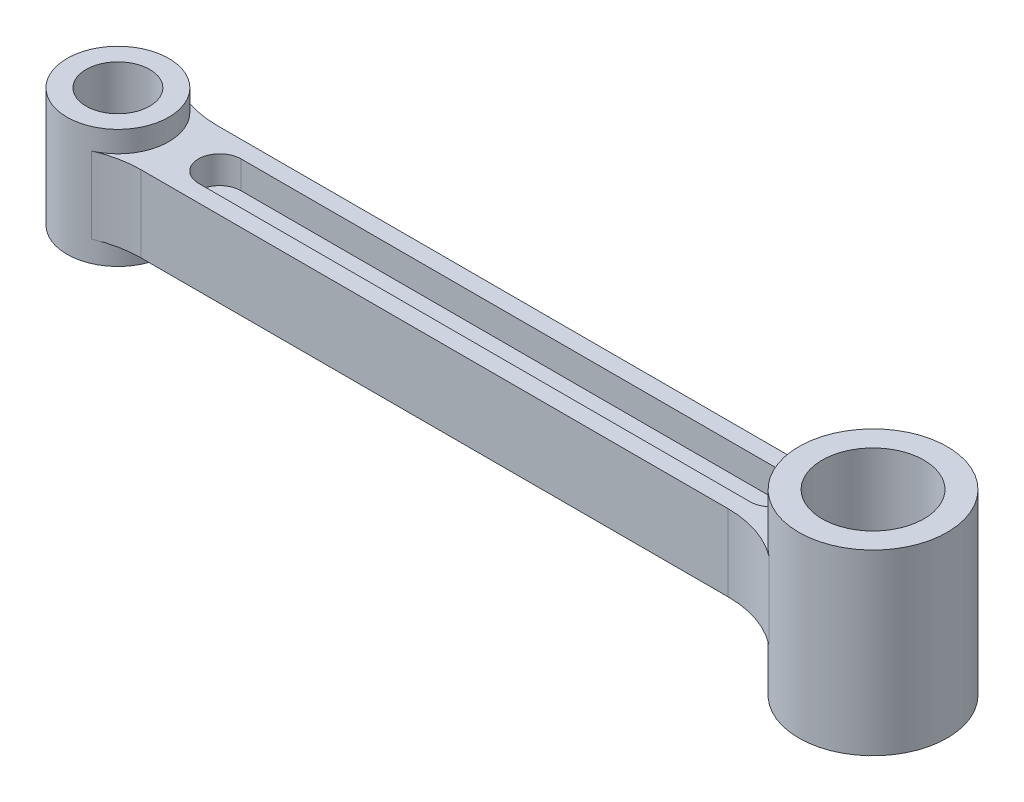
ISO-10303-21;
HEADER;
FILE_DESCRIPTION(('STEP AP214'),'2;1');
FILE_NAME('part.step','',(''),(''),'','','');
FILE_SCHEMA(('AUTOMOTIVE_DESIGN { 1 0 10303 214 1 1 1 1 }'));
ENDSEC;
DATA;
#1=APPLICATION_CONTEXT('core data for automotive mechanical design processes');
#2=APPLICATION_PROTOCOL_DEFINITION('international standard','automotive_design',2000,#1);
#3=PRODUCT_CONTEXT('',#1,'mechanical');
#4=PRODUCT('Part','Part','',(#3));
#5=PRODUCT_RELATED_PRODUCT_CATEGORY('part','',(#4));
#6=PRODUCT_DEFINITION_FORMATION('','',#4);
#7=PRODUCT_DEFINITION_CONTEXT('part definition',#1,'design');
#8=PRODUCT_DEFINITION('design','',#6,#7);
#9=PRODUCT_DEFINITION_SHAPE('','',#8);
#10=(LENGTH_UNIT() NAMED_UNIT(*) SI_UNIT(.MILLI.,.METRE.));
#11=(NAMED_UNIT(*) PLANE_ANGLE_UNIT() SI_UNIT($,.RADIAN.));
#12=(NAMED_UNIT(*) SI_UNIT($,.STERADIAN.) SOLID_ANGLE_UNIT());
#13=UNCERTAINTY_MEASURE_WITH_UNIT(LENGTH_MEASURE(1.E-05),#10,'distance_accuracy_value','');
#14=(GEOMETRIC_REPRESENTATION_CONTEXT(3) GLOBAL_UNCERTAINTY_ASSIGNED_CONTEXT((#13)) GLOBAL_UNIT_ASSIGNED_CONTEXT((#10,
#11,#12)) REPRESENTATION_CONTEXT('',''));
#15=CARTESIAN_POINT('',(0.,0.,0.));
#16=DIRECTION('',(0.,0.,1.));
#17=DIRECTION('',(1.,0.,0.));
#18=AXIS2_PLACEMENT_3D('',#15,#16,#17);
#19=CARTESIAN_POINT('',(154.,9.,0.));
#20=DIRECTION('',(0.,-1.,0.));
#21=DIRECTION('',(0.,0.,-1.));
#22=AXIS2_PLACEMENT_3D('',#19,#20,#21);
#23=CYLINDRICAL_SURFACE('',#22,5.);
#24=DIRECTION('',(0.,-1.,0.));
#25=VECTOR('',#24,1.);
#26=CARTESIAN_POINT('',(154.,9.,4.99999999999998));
#27=LINE('',#26,#25);
#28=CARTESIAN_POINT('',(154.,-2.5,4.99999999999998));
#29=VERTEX_POINT('',#28);
#30=CARTESIAN_POINT('',(154.,-9.,4.99999999999998));
#31=VERTEX_POINT('',#30);
#32=EDGE_CURVE('E180',#29,#31,#27,.T.);
#33=ORIENTED_EDGE('',*,*,#32,.F.);
#34=CARTESIAN_POINT('',(154.,-2.5,0.));
#35=DIRECTION('',(0.,1.,0.));
#36=DIRECTION('',(0.,0.,1.));
#37=AXIS2_PLACEMENT_3D('',#34,#35,#36);
#38=CIRCLE('',#37,5.);
#39=CARTESIAN_POINT('',(154.,-2.5,-5.00000000000002));
#40=VERTEX_POINT('',#39);
#41=EDGE_CURVE('E329',#29,#40,#38,.T.);
#42=ORIENTED_EDGE('',*,*,#41,.T.);
#43=DIRECTION('',(0.,-1.,0.));
#44=VECTOR('',#43,1.);
#45=CARTESIAN_POINT('',(154.,9.,-5.00000000000002));
#46=LINE('',#45,#44);
#47=CARTESIAN_POINT('',(154.,-9.,-5.00000000000002));
#48=VERTEX_POINT('',#47);
#49=EDGE_CURVE('E209',#40,#48,#46,.T.);
#50=ORIENTED_EDGE('',*,*,#49,.T.);
#51=CARTESIAN_POINT('',(154.,-9.,0.));
#52=DIRECTION('',(0.,1.,0.));
#53=DIRECTION('',(0.,0.,1.));
#54=AXIS2_PLACEMENT_3D('',#51,#52,#53);
#55=CIRCLE('',#54,5.);
#56=EDGE_CURVE('E300',#31,#48,#55,.T.);
#57=ORIENTED_EDGE('',*,*,#56,.F.);
#58=EDGE_LOOP('',(#33,#42,#50,#57));
#59=FACE_BOUND('',#58,.T.);
#60=ADVANCED_FACE('F39',(#59),#23,.F.);
#61=CARTESIAN_POINT('',(0.,9.,5.));
#62=DIRECTION('',(0.,0.,-1.));
#63=DIRECTION('',(-1.,0.,0.));
#64=AXIS2_PLACEMENT_3D('',#61,#62,#63);
#65=PLANE('',#64);
#66=DIRECTION('',(0.,-1.,0.));
#67=VECTOR('',#66,1.);
#68=CARTESIAN_POINT('',(24.,9.,5.));
#69=LINE('',#68,#67);
#70=CARTESIAN_POINT('',(24.,-2.5,5.));
#71=VERTEX_POINT('',#70);
#72=CARTESIAN_POINT('',(24.,-9.,5.));
#73=VERTEX_POINT('',#72);
#74=EDGE_CURVE('E316',#71,#73,#69,.T.);
#75=ORIENTED_EDGE('',*,*,#74,.F.);
#76=DIRECTION('',(1.,0.,0.));
#77=VECTOR('',#76,1.);
#78=CARTESIAN_POINT('',(0.,-2.5,5.));
#79=LINE('',#78,#77);
#80=EDGE_CURVE('E56',#71,#29,#79,.T.);
#81=ORIENTED_EDGE('',*,*,#80,.T.);
#82=ORIENTED_EDGE('',*,*,#32,.T.);
#83=DIRECTION('',(1.,0.,0.));
#84=VECTOR('',#83,1.);
#85=CARTESIAN_POINT('',(0.,-9.,5.));
#86=LINE('',#85,#84);
#87=EDGE_CURVE('E303',#73,#31,#86,.T.);
#88=ORIENTED_EDGE('',*,*,#87,.F.);
#89=EDGE_LOOP('',(#75,#81,#82,#88));
#90=FACE_BOUND('',#89,.T.);
#91=ADVANCED_FACE('F231',(#90),#65,.T.);
#92=CARTESIAN_POINT('',(24.,9.,0.));
#93=DIRECTION('',(0.,-1.,0.));
#94=DIRECTION('',(0.,0.,-1.));
#95=AXIS2_PLACEMENT_3D('',#92,#93,#94);
#96=CYLINDRICAL_SURFACE('',#95,5.);
#97=DIRECTION('',(0.,-1.,0.));
#98=VECTOR('',#97,1.);
#99=CARTESIAN_POINT('',(24.,9.,-5.));
#100=LINE('',#99,#98);
#101=CARTESIAN_POINT('',(24.,-2.5,-5.));
#102=VERTEX_POINT('',#101);
#103=CARTESIAN_POINT('',(24.,-9.,-5.));
#104=VERTEX_POINT('',#103);
#105=EDGE_CURVE('E313',#102,#104,#100,.T.);
#106=ORIENTED_EDGE('',*,*,#105,.F.);
#107=CARTESIAN_POINT('',(24.,-2.5,0.));
#108=DIRECTION('',(0.,1.,0.));
#109=DIRECTION('',(0.,0.,1.));
#110=AXIS2_PLACEMENT_3D('',#107,#108,#109);
#111=CIRCLE('',#110,5.);
#112=EDGE_CURVE('E64',#102,#71,#111,.T.);
#113=ORIENTED_EDGE('',*,*,#112,.T.);
#114=ORIENTED_EDGE('',*,*,#74,.T.);
#115=CARTESIAN_POINT('',(24.,-9.,0.));
#116=DIRECTION('',(0.,1.,0.));
#117=DIRECTION('',(0.,0.,1.));
#118=AXIS2_PLACEMENT_3D('',#115,#116,#117);
#119=CIRCLE('',#118,5.);
#120=EDGE_CURVE('E306',#104,#73,#119,.T.);
#121=ORIENTED_EDGE('',*,*,#120,.F.);
#122=EDGE_LOOP('',(#106,#113,#114,#121));
#123=FACE_BOUND('',#122,.T.);
#124=ADVANCED_FACE('F236',(#123),#96,.F.);
#125=CARTESIAN_POINT('',(0.,9.,-4.99999999999999));
#126=DIRECTION('',(0.,0.,-1.));
#127=DIRECTION('',(-1.,0.,0.));
#128=AXIS2_PLACEMENT_3D('',#125,#126,#127);
#129=PLANE('',#128);
#130=DIRECTION('',(1.,0.,0.));
#131=VECTOR('',#130,1.);
#132=CARTESIAN_POINT('',(0.,-2.5,-4.99999999999999));
#133=LINE('',#132,#131);
#134=EDGE_CURVE('E323',#102,#40,#133,.T.);
#135=ORIENTED_EDGE('',*,*,#134,.F.);
#136=ORIENTED_EDGE('',*,*,#105,.T.);
#137=DIRECTION('',(1.,0.,0.));
#138=VECTOR('',#137,1.);
#139=CARTESIAN_POINT('',(0.,-9.,-4.99999999999999));
#140=LINE('',#139,#138);
#141=EDGE_CURVE('E309',#104,#48,#140,.T.);
#142=ORIENTED_EDGE('',*,*,#141,.T.);
#143=ORIENTED_EDGE('',*,*,#49,.F.);
#144=EDGE_LOOP('',(#135,#136,#142,#143));
#145=FACE_BOUND('',#144,.T.);
#146=ADVANCED_FACE('F321',(#145),#129,.F.);
#147=CARTESIAN_POINT('',(178.,21.,0.));
#148=DIRECTION('',(0.,-1.,0.));
#149=DIRECTION('',(0.,0.,-1.));
#150=AXIS2_PLACEMENT_3D('',#147,#148,#149);
#151=CYLINDRICAL_SURFACE('',#150,12.);
#152=CARTESIAN_POINT('',(178.,21.,0.));
#153=DIRECTION('',(0.,1.,0.));
#154=DIRECTION('',(0.,0.,1.));
#155=AXIS2_PLACEMENT_3D('',#152,#153,#154);
#156=CIRCLE('',#155,12.);
#157=CARTESIAN_POINT('',(178.,21.,-12.));
#158=VERTEX_POINT('',#157);
#159=EDGE_CURVE('E48',#158,#158,#156,.T.);
#160=CARTESIAN_POINT('',(178.,-21.,0.));
#161=DIRECTION('',(0.,1.,0.));
#162=DIRECTION('',(0.,0.,1.));
#163=AXIS2_PLACEMENT_3D('',#160,#161,#162);
#164=CIRCLE('',#163,12.);
#165=CARTESIAN_POINT('',(178.,-21.,-12.));
#166=VERTEX_POINT('',#165);
#167=EDGE_CURVE('E179',#166,#166,#164,.T.);
#168=CARTESIAN_POINT('',(178.,21.,-12.));
#169=CARTESIAN_POINT('',(178.,20.5625,-12.));
#170=CARTESIAN_POINT('',(178.,20.125,-12.));
#171=CARTESIAN_POINT('',(178.,19.25,-12.));
#172=CARTESIAN_POINT('',(178.,18.8125,-12.));
#173=CARTESIAN_POINT('',(178.,17.9375,-12.));
#174=CARTESIAN_POINT('',(178.,17.5,-12.));
#175=CARTESIAN_POINT('',(178.,16.625,-12.));
#176=CARTESIAN_POINT('',(178.,16.1875,-12.));
#177=CARTESIAN_POINT('',(178.,15.3125,-12.));
#178=CARTESIAN_POINT('',(178.,14.875,-12.));
#179=CARTESIAN_POINT('',(178.,14.,-12.));
#180=CARTESIAN_POINT('',(178.,13.5625,-12.));
#181=CARTESIAN_POINT('',(178.,12.6875,-12.));
#182=CARTESIAN_POINT('',(178.,12.25,-12.));
#183=CARTESIAN_POINT('',(178.,11.375,-12.));
#184=CARTESIAN_POINT('',(178.,10.9375,-12.));
#185=CARTESIAN_POINT('',(178.,10.0625,-12.));
#186=CARTESIAN_POINT('',(178.,9.625,-12.));
#187=CARTESIAN_POINT('',(178.,8.75,-12.));
#188=CARTESIAN_POINT('',(178.,8.3125,-12.));
#189=CARTESIAN_POINT('',(178.,7.4375,-12.));
#190=CARTESIAN_POINT('',(178.,7.,-12.));
#191=CARTESIAN_POINT('',(178.,6.125,-12.));
#192=CARTESIAN_POINT('',(178.,5.6875,-12.));
#193=CARTESIAN_POINT('',(178.,4.8125,-12.));
#194=CARTESIAN_POINT('',(178.,4.375,-12.));
#195=CARTESIAN_POINT('',(178.,3.5,-12.));
#196=CARTESIAN_POINT('',(178.,3.0625,-12.));
#197=CARTESIAN_POINT('',(178.,2.1875,-12.));
#198=CARTESIAN_POINT('',(178.,1.75,-12.));
#199=CARTESIAN_POINT('',(178.,0.874999999999997,-12.));
#200=CARTESIAN_POINT('',(178.,0.437499999999997,-12.));
#201=CARTESIAN_POINT('',(178.,-0.437500000000004,-12.));
#202=CARTESIAN_POINT('',(178.,-0.875000000000004,-12.));
#203=CARTESIAN_POINT('',(178.,-1.75000000000001,-12.));
#204=CARTESIAN_POINT('',(178.,-2.18750000000001,-12.));
#205=CARTESIAN_POINT('',(178.,-3.0625,-12.));
#206=CARTESIAN_POINT('',(178.,-3.5,-12.));
#207=CARTESIAN_POINT('',(178.,-4.375,-12.));
#208=CARTESIAN_POINT('',(178.,-4.8125,-12.));
#209=CARTESIAN_POINT('',(178.,-5.68750000000001,-12.));
#210=CARTESIAN_POINT('',(178.,-6.12500000000001,-12.));
#211=CARTESIAN_POINT('',(178.,-7.00000000000001,-12.));
#212=CARTESIAN_POINT('',(178.,-7.4375,-12.));
#213=CARTESIAN_POINT('',(178.,-8.3125,-12.));
#214=CARTESIAN_POINT('',(178.,-8.75,-12.));
#215=CARTESIAN_POINT('',(178.,-9.625,-12.));
#216=CARTESIAN_POINT('',(178.,-10.0625,-12.));
#217=CARTESIAN_POINT('',(178.,-10.9375,-12.));
#218=CARTESIAN_POINT('',(178.,-11.375,-12.));
#219=CARTESIAN_POINT('',(178.,-12.25,-12.));
#220=CARTESIAN_POINT('',(178.,-12.6875,-12.));
#221=CARTESIAN_POINT('',(178.,-13.5625,-12.));
#222=CARTESIAN_POINT('',(178.,-14.,-12.));
#223=CARTESIAN_POINT('',(178.,-14.875,-12.));
#224=CARTESIAN_POINT('',(178.,-15.3125,-12.));
#225=CARTESIAN_POINT('',(178.,-16.1875,-12.));
#226=CARTESIAN_POINT('',(178.,-16.625,-12.));
#227=CARTESIAN_POINT('',(178.,-17.5,-12.));
#228=CARTESIAN_POINT('',(178.,-17.9375,-12.));
#229=CARTESIAN_POINT('',(178.,-18.8125,-12.));
#230=CARTESIAN_POINT('',(178.,-19.25,-12.));
#231=CARTESIAN_POINT('',(178.,-20.125,-12.));
#232=CARTESIAN_POINT('',(178.,-20.5625,-12.));
#233=CARTESIAN_POINT('',(178.,-21.,-12.));
#234=B_SPLINE_CURVE_WITH_KNOTS('',3,(#168,#169,#170,#171,#172,#173,#174,#175,#176,#177,#178,
#179,#180,#181,#182,#183,#184,#185,#186,#187,#188,#189,#190,#191,#192,#193,#194,#195,#196,#197,
#198,#199,#200,#201,#202,#203,#204,#205,#206,#207,#208,#209,#210,#211,#212,#213,#214,#215,#216,
#217,#218,#219,#220,#221,#222,#223,#224,#225,#226,#227,#228,#229,#230,#231,#232,#233),
.UNSPECIFIED.,.F.,.F.,(4,2,2,2,2,2,2,2,2,2,2,2,2,2,2,2,2,2,2,2,2,2,2,2,2,2,2,2,2,2,2,2,4),(0.,
1.3125,2.625,3.9375,5.25,6.5625,7.875,9.1875,10.5,11.8125,13.125,14.4375,15.75,17.0625,18.375,
19.6875,21.,22.3125,23.625,24.9375,26.25,27.5625,28.875,30.1875,31.5,32.8125,34.125,35.4375,
36.75,38.0625,39.375,40.6875,42.),.UNSPECIFIED.);
#235=EDGE_CURVE('BSEAM41',#158,#166,#234,.T.);
#236=ORIENTED_EDGE('',*,*,#159,.T.);
#237=ORIENTED_EDGE('',*,*,#167,.F.);
#238=ORIENTED_EDGE('',*,*,#235,.T.);
#239=ORIENTED_EDGE('',*,*,#235,.F.);
#240=EDGE_LOOP('',(#236,#238,#237,#239));
#241=FACE_BOUND('',#240,.T.);
#242=ADVANCED_FACE('F41',(#241),#151,.F.);
#243=CARTESIAN_POINT('',(178.,21.,0.));
#244=DIRECTION('',(0.,-1.,0.));
#245=DIRECTION('',(0.,0.,-1.));
#246=AXIS2_PLACEMENT_3D('',#243,#244,#245);
#247=CYLINDRICAL_SURFACE('',#246,17.5);
#248=DIRECTION('',(0.,-1.,0.));
#249=VECTOR('',#248,1.);
#250=CARTESIAN_POINT('',(167.388481117454,9.,-13.9156626506024));
#251=LINE('',#250,#249);
#252=CARTESIAN_POINT('',(167.388481117454,9.,-13.9156626506024));
#253=VERTEX_POINT('',#252);
#254=CARTESIAN_POINT('',(167.388481117454,-9.,-13.9156626506024));
#255=VERTEX_POINT('',#254);
#256=EDGE_CURVE('E206',#253,#255,#251,.T.);
#257=ORIENTED_EDGE('',*,*,#256,.F.);
#258=CARTESIAN_POINT('',(178.,9.,0.));
#259=DIRECTION('',(0.,1.,0.));
#260=DIRECTION('',(0.,0.,1.));
#261=AXIS2_PLACEMENT_3D('',#258,#259,#260);
#262=CIRCLE('',#261,17.5);
#263=CARTESIAN_POINT('',(167.388481117454,9.,13.9156626506024));
#264=VERTEX_POINT('',#263);
#265=EDGE_CURVE('E312',#253,#264,#262,.T.);
#266=ORIENTED_EDGE('',*,*,#265,.T.);
#267=DIRECTION('',(0.,-1.,0.));
#268=VECTOR('',#267,1.);
#269=CARTESIAN_POINT('',(167.388481117454,9.,13.9156626506024));
#270=LINE('',#269,#268);
#271=CARTESIAN_POINT('',(167.388481117454,-9.,13.9156626506024));
#272=VERTEX_POINT('',#271);
#273=EDGE_CURVE('E187',#264,#272,#270,.T.);
#274=ORIENTED_EDGE('',*,*,#273,.T.);
#275=CARTESIAN_POINT('',(178.,-9.,0.));
#276=DIRECTION('',(0.,1.,0.));
#277=DIRECTION('',(0.,0.,1.));
#278=AXIS2_PLACEMENT_3D('',#275,#276,#277);
#279=CIRCLE('',#278,17.5);
#280=EDGE_CURVE('E278',#255,#272,#279,.T.);
#281=ORIENTED_EDGE('',*,*,#280,.F.);
#282=EDGE_LOOP('',(#257,#266,#274,#281));
#283=FACE_BOUND('',#282,.T.);
#284=CARTESIAN_POINT('',(178.,21.,0.));
#285=DIRECTION('',(0.,1.,0.));
#286=DIRECTION('',(0.,0.,1.));
#287=AXIS2_PLACEMENT_3D('',#284,#285,#286);
#288=CIRCLE('',#287,17.5);
#289=CARTESIAN_POINT('',(178.,21.,17.5));
#290=VERTEX_POINT('',#289);
#291=EDGE_CURVE('E11',#290,#290,#288,.T.);
#292=ORIENTED_EDGE('',*,*,#291,.F.);
#293=EDGE_LOOP('',(#292));
#294=FACE_BOUND('',#293,.T.);
#295=CARTESIAN_POINT('',(178.,-21.,0.));
#296=DIRECTION('',(0.,1.,0.));
#297=DIRECTION('',(0.,0.,1.));
#298=AXIS2_PLACEMENT_3D('',#295,#296,#297);
#299=CIRCLE('',#298,17.5);
#300=CARTESIAN_POINT('',(178.,-21.,17.5));
#301=VERTEX_POINT('',#300);
#302=EDGE_CURVE('E43',#301,#301,#299,.T.);
#303=ORIENTED_EDGE('',*,*,#302,.T.);
#304=EDGE_LOOP('',(#303));
#305=FACE_BOUND('',#304,.T.);
#306=ADVANCED_FACE('F216',(#283,#294,#305),#247,.T.);
#307=CARTESIAN_POINT('',(0.,21.,0.));
#308=DIRECTION('',(0.,1.,0.));
#309=DIRECTION('',(0.,0.,1.));
#310=AXIS2_PLACEMENT_3D('',#307,#308,#309);
#311=PLANE('',#310);
#312=ORIENTED_EDGE('',*,*,#159,.F.);
#313=EDGE_LOOP('',(#312));
#314=FACE_BOUND('',#313,.T.);
#315=ORIENTED_EDGE('',*,*,#291,.T.);
#316=EDGE_LOOP('',(#315));
#317=FACE_BOUND('',#316,.T.);
#318=ADVANCED_FACE('F220',(#314,#317),#311,.T.);
#319=CARTESIAN_POINT('',(0.,-21.,0.));
#320=DIRECTION('',(0.,1.,0.));
#321=DIRECTION('',(0.,0.,1.));
#322=AXIS2_PLACEMENT_3D('',#319,#320,#321);
#323=PLANE('',#322);
#324=ORIENTED_EDGE('',*,*,#167,.T.);
#325=EDGE_LOOP('',(#324));
#326=FACE_BOUND('',#325,.T.);
#327=ORIENTED_EDGE('',*,*,#302,.F.);
#328=EDGE_LOOP('',(#327));
#329=FACE_BOUND('',#328,.T.);
#330=ADVANCED_FACE('F218',(#326,#329),#323,.F.);
#331=CARTESIAN_POINT('',(154.,2.5,0.));
#332=DIRECTION('',(0.,1.,0.));
#333=DIRECTION('',(0.,0.,1.));
#334=AXIS2_PLACEMENT_3D('',#331,#332,#333);
#335=CIRCLE('',#334,5.);
#336=CARTESIAN_POINT('',(154.,2.5,4.99999999999998));
#337=VERTEX_POINT('',#336);
#338=CARTESIAN_POINT('',(154.,2.5,-5.00000000000002));
#339=VERTEX_POINT('',#338);
#340=EDGE_CURVE('E157',#337,#339,#335,.T.);
#341=ORIENTED_EDGE('',*,*,#340,.F.);
#342=CARTESIAN_POINT('',(154.,9.,4.99999999999998));
#343=VERTEX_POINT('',#342);
#344=EDGE_CURVE('E169',#343,#337,#27,.T.);
#345=ORIENTED_EDGE('',*,*,#344,.F.);
#346=CARTESIAN_POINT('',(154.,9.,0.));
#347=DIRECTION('',(0.,1.,0.));
#348=DIRECTION('',(0.,0.,1.));
#349=AXIS2_PLACEMENT_3D('',#346,#347,#348);
#350=CIRCLE('',#349,5.);
#351=CARTESIAN_POINT('',(154.,9.,-5.00000000000002));
#352=VERTEX_POINT('',#351);
#353=EDGE_CURVE('E367',#343,#352,#350,.T.);
#354=ORIENTED_EDGE('',*,*,#353,.T.);
#355=EDGE_CURVE('E172',#352,#339,#46,.T.);
#356=ORIENTED_EDGE('',*,*,#355,.T.);
#357=EDGE_LOOP('',(#341,#345,#354,#356));
#358=FACE_BOUND('',#357,.T.);
#359=ADVANCED_FACE('F167',(#358),#23,.F.);
#360=DIRECTION('',(1.,0.,0.));
#361=VECTOR('',#360,1.);
#362=CARTESIAN_POINT('',(0.,2.5,5.));
#363=LINE('',#362,#361);
#364=CARTESIAN_POINT('',(24.,2.5,5.));
#365=VERTEX_POINT('',#364);
#366=EDGE_CURVE('E154',#365,#337,#363,.T.);
#367=ORIENTED_EDGE('',*,*,#366,.F.);
#368=CARTESIAN_POINT('',(24.,9.,5.));
#369=VERTEX_POINT('',#368);
#370=EDGE_CURVE('E183',#369,#365,#69,.T.);
#371=ORIENTED_EDGE('',*,*,#370,.F.);
#372=DIRECTION('',(1.,0.,0.));
#373=VECTOR('',#372,1.);
#374=CARTESIAN_POINT('',(0.,9.,5.));
#375=LINE('',#374,#373);
#376=EDGE_CURVE('E178',#369,#343,#375,.T.);
#377=ORIENTED_EDGE('',*,*,#376,.T.);
#378=ORIENTED_EDGE('',*,*,#344,.T.);
#379=EDGE_LOOP('',(#367,#371,#377,#378));
#380=FACE_BOUND('',#379,.T.);
#381=ADVANCED_FACE('F176',(#380),#65,.T.);
#382=CARTESIAN_POINT('',(24.,2.5,0.));
#383=DIRECTION('',(0.,1.,0.));
#384=DIRECTION('',(0.,0.,1.));
#385=AXIS2_PLACEMENT_3D('',#382,#383,#384);
#386=CIRCLE('',#385,5.);
#387=CARTESIAN_POINT('',(24.,2.5,-5.));
#388=VERTEX_POINT('',#387);
#389=EDGE_CURVE('E160',#388,#365,#386,.T.);
#390=ORIENTED_EDGE('',*,*,#389,.F.);
#391=CARTESIAN_POINT('',(24.,9.,-5.));
#392=VERTEX_POINT('',#391);
#393=EDGE_CURVE('E314',#392,#388,#100,.T.);
#394=ORIENTED_EDGE('',*,*,#393,.F.);
#395=CARTESIAN_POINT('',(24.,9.,0.));
#396=DIRECTION('',(0.,1.,0.));
#397=DIRECTION('',(0.,0.,1.));
#398=AXIS2_PLACEMENT_3D('',#395,#396,#397);
#399=CIRCLE('',#398,5.);
#400=EDGE_CURVE('E370',#392,#369,#399,.T.);
#401=ORIENTED_EDGE('',*,*,#400,.T.);
#402=ORIENTED_EDGE('',*,*,#370,.T.);
#403=EDGE_LOOP('',(#390,#394,#401,#402));
#404=FACE_BOUND('',#403,.T.);
#405=ADVANCED_FACE('F263',(#404),#96,.F.);
#406=CARTESIAN_POINT('',(152.835540935677,9.,-33.));
#407=DIRECTION('',(0.,-1.,0.));
#408=DIRECTION('',(0.,0.,-1.));
#409=AXIS2_PLACEMENT_3D('',#406,#407,#408);
#410=CYLINDRICAL_SURFACE('',#409,24.);
#411=CARTESIAN_POINT('',(152.835540935677,-9.,-33.));
#412=DIRECTION('',(0.,1.,0.));
#413=DIRECTION('',(0.,0.,1.));
#414=AXIS2_PLACEMENT_3D('',#411,#412,#413);
#415=CIRCLE('',#414,24.);
#416=CARTESIAN_POINT('',(152.835540935677,-9.,-9.));
#417=VERTEX_POINT('',#416);
#418=EDGE_CURVE('E271',#417,#255,#415,.T.);
#419=ORIENTED_EDGE('',*,*,#418,.F.);
#420=DIRECTION('',(0.,-1.,0.));
#421=VECTOR('',#420,1.);
#422=CARTESIAN_POINT('',(152.835540935677,9.,-9.));
#423=LINE('',#422,#421);
#424=CARTESIAN_POINT('',(152.835540935677,9.,-9.));
#425=VERTEX_POINT('',#424);
#426=EDGE_CURVE('E204',#425,#417,#423,.T.);
#427=ORIENTED_EDGE('',*,*,#426,.F.);
#428=CARTESIAN_POINT('',(152.835540935677,9.,-33.));
#429=DIRECTION('',(0.,1.,0.));
#430=DIRECTION('',(0.,0.,1.));
#431=AXIS2_PLACEMENT_3D('',#428,#429,#430);
#432=CIRCLE('',#431,24.);
#433=EDGE_CURVE('E350',#425,#253,#432,.T.);
#434=ORIENTED_EDGE('',*,*,#433,.T.);
#435=ORIENTED_EDGE('',*,*,#256,.T.);
#436=EDGE_LOOP('',(#419,#427,#434,#435));
#437=FACE_BOUND('',#436,.T.);
#438=ADVANCED_FACE('F260',(#437),#410,.F.);
#439=CARTESIAN_POINT('',(0.,9.,-9.));
#440=DIRECTION('',(0.,0.,-1.));
#441=DIRECTION('',(-1.,0.,0.));
#442=AXIS2_PLACEMENT_3D('',#439,#440,#441);
#443=PLANE('',#442);
#444=DIRECTION('',(1.,0.,0.));
#445=VECTOR('',#444,1.);
#446=CARTESIAN_POINT('',(0.,-9.,-9.));
#447=LINE('',#446,#445);
#448=CARTESIAN_POINT('',(14.3874945699382,-9.,-9.));
#449=VERTEX_POINT('',#448);
#450=EDGE_CURVE('E277',#449,#417,#447,.T.);
#451=ORIENTED_EDGE('',*,*,#450,.F.);
#452=DIRECTION('',(0.,-1.,0.));
#453=VECTOR('',#452,1.);
#454=CARTESIAN_POINT('',(14.3874945699382,9.,-9.));
#455=LINE('',#454,#453);
#456=CARTESIAN_POINT('',(14.3874945699382,9.,-9.));
#457=VERTEX_POINT('',#456);
#458=EDGE_CURVE('E202',#457,#449,#455,.T.);
#459=ORIENTED_EDGE('',*,*,#458,.F.);
#460=DIRECTION('',(1.,0.,0.));
#461=VECTOR('',#460,1.);
#462=CARTESIAN_POINT('',(0.,9.,-9.));
#463=LINE('',#462,#461);
#464=EDGE_CURVE('E352',#457,#425,#463,.T.);
#465=ORIENTED_EDGE('',*,*,#464,.T.);
#466=ORIENTED_EDGE('',*,*,#426,.T.);
#467=EDGE_LOOP('',(#451,#459,#465,#466));
#468=FACE_BOUND('',#467,.T.);
#469=ADVANCED_FACE('F256',(#468),#443,.T.);
#470=CARTESIAN_POINT('',(14.3874945699382,9.,-33.));
#471=DIRECTION('',(0.,-1.,0.));
#472=DIRECTION('',(0.,0.,-1.));
#473=AXIS2_PLACEMENT_3D('',#470,#471,#472);
#474=CYLINDRICAL_SURFACE('',#473,24.);
#475=CARTESIAN_POINT('',(14.3874945699382,-9.,-33.));
#476=DIRECTION('',(0.,1.,0.));
#477=DIRECTION('',(0.,0.,1.));
#478=AXIS2_PLACEMENT_3D('',#475,#476,#477);
#479=CIRCLE('',#478,24.);
#480=CARTESIAN_POINT('',(4.79583152331272,-9.,-11.));
#481=VERTEX_POINT('',#480);
#482=EDGE_CURVE('E285',#481,#449,#479,.T.);
#483=ORIENTED_EDGE('',*,*,#482,.F.);
#484=DIRECTION('',(0.,-1.,0.));
#485=VECTOR('',#484,1.);
#486=CARTESIAN_POINT('',(4.79583152331272,9.,-11.));
#487=LINE('',#486,#485);
#488=CARTESIAN_POINT('',(4.79583152331272,9.,-11.));
#489=VERTEX_POINT('',#488);
#490=EDGE_CURVE('E199',#489,#481,#487,.T.);
#491=ORIENTED_EDGE('',*,*,#490,.F.);
#492=CARTESIAN_POINT('',(14.3874945699382,9.,-33.));
#493=DIRECTION('',(0.,1.,0.));
#494=DIRECTION('',(0.,0.,1.));
#495=AXIS2_PLACEMENT_3D('',#492,#493,#494);
#496=CIRCLE('',#495,24.);
#497=EDGE_CURVE('E355',#489,#457,#496,.T.);
#498=ORIENTED_EDGE('',*,*,#497,.T.);
#499=ORIENTED_EDGE('',*,*,#458,.T.);
#500=EDGE_LOOP('',(#483,#491,#498,#499));
#501=FACE_BOUND('',#500,.T.);
#502=ADVANCED_FACE('F252',(#501),#474,.F.);
#503=CARTESIAN_POINT('',(14.3874945699382,9.,33.));
#504=DIRECTION('',(0.,-1.,0.));
#505=DIRECTION('',(0.,0.,-1.));
#506=AXIS2_PLACEMENT_3D('',#503,#504,#505);
#507=CYLINDRICAL_SURFACE('',#506,24.);
#508=CARTESIAN_POINT('',(14.3874945699382,-9.,33.));
#509=DIRECTION('',(0.,1.,0.));
#510=DIRECTION('',(0.,0.,1.));
#511=AXIS2_PLACEMENT_3D('',#508,#509,#510);
#512=CIRCLE('',#511,24.);
#513=CARTESIAN_POINT('',(4.79583152331272,-9.,11.));
#514=VERTEX_POINT('',#513);
#515=CARTESIAN_POINT('',(14.3874945699382,-9.,9.));
#516=VERTEX_POINT('',#515);
#517=EDGE_CURVE('E293',#514,#516,#512,.F.);
#518=ORIENTED_EDGE('',*,*,#517,.T.);
#519=DIRECTION('',(0.,-1.,0.));
#520=VECTOR('',#519,1.);
#521=CARTESIAN_POINT('',(14.3874945699382,9.,9.));
#522=LINE('',#521,#520);
#523=CARTESIAN_POINT('',(14.3874945699382,9.,9.));
#524=VERTEX_POINT('',#523);
#525=EDGE_CURVE('E193',#524,#516,#522,.T.);
#526=ORIENTED_EDGE('',*,*,#525,.F.);
#527=CARTESIAN_POINT('',(14.3874945699382,9.,33.));
#528=DIRECTION('',(0.,1.,0.));
#529=DIRECTION('',(0.,0.,1.));
#530=AXIS2_PLACEMENT_3D('',#527,#528,#529);
#531=CIRCLE('',#530,24.);
#532=CARTESIAN_POINT('',(4.79583152331272,9.,11.));
#533=VERTEX_POINT('',#532);
#534=EDGE_CURVE('E360',#533,#524,#531,.F.);
#535=ORIENTED_EDGE('',*,*,#534,.F.);
#536=DIRECTION('',(0.,-1.,0.));
#537=VECTOR('',#536,1.);
#538=CARTESIAN_POINT('',(4.79583152331272,9.,11.));
#539=LINE('',#538,#537);
#540=EDGE_CURVE('E196',#533,#514,#539,.T.);
#541=ORIENTED_EDGE('',*,*,#540,.T.);
#542=EDGE_LOOP('',(#518,#526,#535,#541));
#543=FACE_BOUND('',#542,.T.);
#544=ADVANCED_FACE('F248',(#543),#507,.F.);
#545=CARTESIAN_POINT('',(0.,9.,9.));
#546=DIRECTION('',(0.,0.,-1.));
#547=DIRECTION('',(-1.,0.,0.));
#548=AXIS2_PLACEMENT_3D('',#545,#546,#547);
#549=PLANE('',#548);
#550=DIRECTION('',(1.,0.,0.));
#551=VECTOR('',#550,1.);
#552=CARTESIAN_POINT('',(0.,-9.,9.));
#553=LINE('',#552,#551);
#554=CARTESIAN_POINT('',(152.835540935677,-9.,9.));
#555=VERTEX_POINT('',#554);
#556=EDGE_CURVE('E295',#516,#555,#553,.T.);
#557=ORIENTED_EDGE('',*,*,#556,.T.);
#558=DIRECTION('',(0.,-1.,0.));
#559=VECTOR('',#558,1.);
#560=CARTESIAN_POINT('',(152.835540935677,9.,9.));
#561=LINE('',#560,#559);
#562=CARTESIAN_POINT('',(152.835540935677,9.,9.));
#563=VERTEX_POINT('',#562);
#564=EDGE_CURVE('E189',#563,#555,#561,.T.);
#565=ORIENTED_EDGE('',*,*,#564,.F.);
#566=DIRECTION('',(1.,0.,0.));
#567=VECTOR('',#566,1.);
#568=CARTESIAN_POINT('',(0.,9.,9.));
#569=LINE('',#568,#567);
#570=EDGE_CURVE('E362',#524,#563,#569,.T.);
#571=ORIENTED_EDGE('',*,*,#570,.F.);
#572=ORIENTED_EDGE('',*,*,#525,.T.);
#573=EDGE_LOOP('',(#557,#565,#571,#572));
#574=FACE_BOUND('',#573,.T.);
#575=ADVANCED_FACE('F244',(#574),#549,.F.);
#576=CARTESIAN_POINT('',(152.835540935677,9.,33.));
#577=DIRECTION('',(0.,-1.,0.));
#578=DIRECTION('',(0.,0.,-1.));
#579=AXIS2_PLACEMENT_3D('',#576,#577,#578);
#580=CYLINDRICAL_SURFACE('',#579,24.);
#581=CARTESIAN_POINT('',(152.835540935677,-9.,33.));
#582=DIRECTION('',(0.,1.,0.));
#583=DIRECTION('',(0.,0.,1.));
#584=AXIS2_PLACEMENT_3D('',#581,#582,#583);
#585=CIRCLE('',#584,24.);
#586=EDGE_CURVE('E297',#555,#272,#585,.F.);
#587=ORIENTED_EDGE('',*,*,#586,.T.);
#588=ORIENTED_EDGE('',*,*,#273,.F.);
#589=CARTESIAN_POINT('',(152.835540935677,9.,33.));
#590=DIRECTION('',(0.,1.,0.));
#591=DIRECTION('',(0.,0.,1.));
#592=AXIS2_PLACEMENT_3D('',#589,#590,#591);
#593=CIRCLE('',#592,24.);
#594=EDGE_CURVE('E364',#563,#264,#593,.F.);
#595=ORIENTED_EDGE('',*,*,#594,.F.);
#596=ORIENTED_EDGE('',*,*,#564,.T.);
#597=EDGE_LOOP('',(#587,#588,#595,#596));
#598=FACE_BOUND('',#597,.T.);
#599=ADVANCED_FACE('F240',(#598),#580,.F.);
#600=ORIENTED_EDGE('',*,*,#393,.T.);
#601=DIRECTION('',(1.,0.,0.));
#602=VECTOR('',#601,1.);
#603=CARTESIAN_POINT('',(0.,2.5,-4.99999999999999));
#604=LINE('',#603,#602);
#605=EDGE_CURVE('E173',#388,#339,#604,.T.);
#606=ORIENTED_EDGE('',*,*,#605,.T.);
#607=ORIENTED_EDGE('',*,*,#355,.F.);
#608=DIRECTION('',(1.,0.,0.));
#609=VECTOR('',#608,1.);
#610=CARTESIAN_POINT('',(0.,9.,-4.99999999999999));
#611=LINE('',#610,#609);
#612=EDGE_CURVE('E190',#392,#352,#611,.T.);
#613=ORIENTED_EDGE('',*,*,#612,.F.);
#614=EDGE_LOOP('',(#600,#606,#607,#613));
#615=FACE_BOUND('',#614,.T.);
#616=ADVANCED_FACE('F243',(#615),#129,.F.);
#617=CARTESIAN_POINT('',(0.,9.,0.));
#618=DIRECTION('',(0.,1.,0.));
#619=DIRECTION('',(0.,0.,1.));
#620=AXIS2_PLACEMENT_3D('',#617,#618,#619);
#621=PLANE('',#620);
#622=ORIENTED_EDGE('',*,*,#265,.F.);
#623=ORIENTED_EDGE('',*,*,#433,.F.);
#624=ORIENTED_EDGE('',*,*,#464,.F.);
#625=ORIENTED_EDGE('',*,*,#497,.F.);
#626=CARTESIAN_POINT('',(0.,9.,0.));
#627=DIRECTION('',(0.,1.,0.));
#628=DIRECTION('',(0.,0.,1.));
#629=AXIS2_PLACEMENT_3D('',#626,#627,#628);
#630=CIRCLE('',#629,12.);
#631=EDGE_CURVE('E358',#489,#533,#630,.F.);
#632=ORIENTED_EDGE('',*,*,#631,.T.);
#633=ORIENTED_EDGE('',*,*,#534,.T.);
#634=ORIENTED_EDGE('',*,*,#570,.T.);
#635=ORIENTED_EDGE('',*,*,#594,.T.);
#636=EDGE_LOOP('',(#622,#623,#624,#625,#632,#633,#634,#635));
#637=FACE_BOUND('',#636,.T.);
#638=ORIENTED_EDGE('',*,*,#353,.F.);
#639=ORIENTED_EDGE('',*,*,#376,.F.);
#640=ORIENTED_EDGE('',*,*,#400,.F.);
#641=ORIENTED_EDGE('',*,*,#612,.T.);
#642=EDGE_LOOP('',(#638,#639,#640,#641));
#643=FACE_BOUND('',#642,.T.);
#644=ADVANCED_FACE('F392',(#637,#643),#621,.T.);
#645=CARTESIAN_POINT('',(0.,-9.,0.));
#646=DIRECTION('',(0.,1.,0.));
#647=DIRECTION('',(0.,0.,1.));
#648=AXIS2_PLACEMENT_3D('',#645,#646,#647);
#649=PLANE('',#648);
#650=ORIENTED_EDGE('',*,*,#280,.T.);
#651=ORIENTED_EDGE('',*,*,#586,.F.);
#652=ORIENTED_EDGE('',*,*,#556,.F.);
#653=ORIENTED_EDGE('',*,*,#517,.F.);
#654=CARTESIAN_POINT('',(0.,-9.,0.));
#655=DIRECTION('',(0.,1.,0.));
#656=DIRECTION('',(0.,0.,1.));
#657=AXIS2_PLACEMENT_3D('',#654,#655,#656);
#658=CIRCLE('',#657,12.);
#659=EDGE_CURVE('E287',#481,#514,#658,.F.);
#660=ORIENTED_EDGE('',*,*,#659,.F.);
#661=ORIENTED_EDGE('',*,*,#482,.T.);
#662=ORIENTED_EDGE('',*,*,#450,.T.);
#663=ORIENTED_EDGE('',*,*,#418,.T.);
#664=EDGE_LOOP('',(#650,#651,#652,#653,#660,#661,#662,#663));
#665=FACE_BOUND('',#664,.T.);
#666=ORIENTED_EDGE('',*,*,#56,.T.);
#667=ORIENTED_EDGE('',*,*,#141,.F.);
#668=ORIENTED_EDGE('',*,*,#120,.T.);
#669=ORIENTED_EDGE('',*,*,#87,.T.);
#670=EDGE_LOOP('',(#666,#667,#668,#669));
#671=FACE_BOUND('',#670,.T.);
#672=ADVANCED_FACE('F282',(#665,#671),#649,.F.);
#673=CARTESIAN_POINT('',(0.,14.,0.));
#674=DIRECTION('',(0.,-1.,0.));
#675=DIRECTION('',(0.,0.,-1.));
#676=AXIS2_PLACEMENT_3D('',#673,#674,#675);
#677=CYLINDRICAL_SURFACE('',#676,12.);
#678=ORIENTED_EDGE('',*,*,#540,.F.);
#679=ORIENTED_EDGE('',*,*,#631,.F.);
#680=ORIENTED_EDGE('',*,*,#490,.T.);
#681=ORIENTED_EDGE('',*,*,#659,.T.);
#682=EDGE_LOOP('',(#678,#679,#680,#681));
#683=FACE_BOUND('',#682,.T.);
#684=CARTESIAN_POINT('',(0.,14.,0.));
#685=DIRECTION('',(0.,1.,0.));
#686=DIRECTION('',(0.,0.,1.));
#687=AXIS2_PLACEMENT_3D('',#684,#685,#686);
#688=CIRCLE('',#687,12.);
#689=CARTESIAN_POINT('',(0.,14.,12.));
#690=VERTEX_POINT('',#689);
#691=EDGE_CURVE('E337',#690,#690,#688,.F.);
#692=ORIENTED_EDGE('',*,*,#691,.T.);
#693=EDGE_LOOP('',(#692));
#694=FACE_BOUND('',#693,.T.);
#695=CARTESIAN_POINT('',(0.,-14.,0.));
#696=DIRECTION('',(0.,1.,0.));
#697=DIRECTION('',(0.,0.,1.));
#698=AXIS2_PLACEMENT_3D('',#695,#696,#697);
#699=CIRCLE('',#698,12.);
#700=CARTESIAN_POINT('',(0.,-14.,12.));
#701=VERTEX_POINT('',#700);
#702=EDGE_CURVE('E344',#701,#701,#699,.F.);
#703=ORIENTED_EDGE('',*,*,#702,.F.);
#704=EDGE_LOOP('',(#703));
#705=FACE_BOUND('',#704,.T.);
#706=ADVANCED_FACE('F387',(#683,#694,#705),#677,.T.);
#707=CARTESIAN_POINT('',(0.,14.,0.));
#708=DIRECTION('',(0.,-1.,0.));
#709=DIRECTION('',(0.,0.,-1.));
#710=AXIS2_PLACEMENT_3D('',#707,#708,#709);
#711=CYLINDRICAL_SURFACE('',#710,7.5);
#712=CARTESIAN_POINT('',(0.,14.,0.));
#713=DIRECTION('',(0.,1.,0.));
#714=DIRECTION('',(0.,0.,1.));
#715=AXIS2_PLACEMENT_3D('',#712,#713,#714);
#716=CIRCLE('',#715,7.5);
#717=CARTESIAN_POINT('',(0.,14.,7.5));
#718=VERTEX_POINT('',#717);
#719=EDGE_CURVE('E340',#718,#718,#716,.T.);
#720=ORIENTED_EDGE('',*,*,#719,.T.);
#721=EDGE_LOOP('',(#720));
#722=FACE_BOUND('',#721,.T.);
#723=CARTESIAN_POINT('',(0.,-14.,0.));
#724=DIRECTION('',(0.,1.,0.));
#725=DIRECTION('',(0.,0.,1.));
#726=AXIS2_PLACEMENT_3D('',#723,#724,#725);
#727=CIRCLE('',#726,7.5);
#728=CARTESIAN_POINT('',(0.,-14.,7.5));
#729=VERTEX_POINT('',#728);
#730=EDGE_CURVE('E341',#729,#729,#727,.T.);
#731=ORIENTED_EDGE('',*,*,#730,.F.);
#732=EDGE_LOOP('',(#731));
#733=FACE_BOUND('',#732,.T.);
#734=ADVANCED_FACE('F442',(#722,#733),#711,.F.);
#735=CARTESIAN_POINT('',(0.,14.,0.));
#736=DIRECTION('',(0.,1.,0.));
#737=DIRECTION('',(0.,0.,1.));
#738=AXIS2_PLACEMENT_3D('',#735,#736,#737);
#739=PLANE('',#738);
#740=ORIENTED_EDGE('',*,*,#691,.F.);
#741=EDGE_LOOP('',(#740));
#742=FACE_BOUND('',#741,.T.);
#743=ORIENTED_EDGE('',*,*,#719,.F.);
#744=EDGE_LOOP('',(#743));
#745=FACE_BOUND('',#744,.T.);
#746=ADVANCED_FACE('F430',(#742,#745),#739,.T.);
#747=CARTESIAN_POINT('',(0.,-14.,0.));
#748=DIRECTION('',(0.,1.,0.));
#749=DIRECTION('',(0.,0.,1.));
#750=AXIS2_PLACEMENT_3D('',#747,#748,#749);
#751=PLANE('',#750);
#752=ORIENTED_EDGE('',*,*,#702,.T.);
#753=EDGE_LOOP('',(#752));
#754=FACE_BOUND('',#753,.T.);
#755=ORIENTED_EDGE('',*,*,#730,.T.);
#756=EDGE_LOOP('',(#755));
#757=FACE_BOUND('',#756,.T.);
#758=ADVANCED_FACE('F425',(#754,#757),#751,.F.);
#759=CARTESIAN_POINT('',(0.,-2.5,0.));
#760=DIRECTION('',(0.,1.,0.));
#761=DIRECTION('',(0.,0.,1.));
#762=AXIS2_PLACEMENT_3D('',#759,#760,#761);
#763=PLANE('',#762);
#764=ORIENTED_EDGE('',*,*,#80,.F.);
#765=ORIENTED_EDGE('',*,*,#112,.F.);
#766=ORIENTED_EDGE('',*,*,#134,.T.);
#767=ORIENTED_EDGE('',*,*,#41,.F.);
#768=EDGE_LOOP('',(#764,#765,#766,#767));
#769=FACE_BOUND('',#768,.T.);
#770=ADVANCED_FACE('F332',(#769),#763,.F.);
#771=CARTESIAN_POINT('',(0.,2.5,0.));
#772=DIRECTION('',(0.,1.,0.));
#773=DIRECTION('',(0.,0.,1.));
#774=AXIS2_PLACEMENT_3D('',#771,#772,#773);
#775=PLANE('',#774);
#776=ORIENTED_EDGE('',*,*,#366,.T.);
#777=ORIENTED_EDGE('',*,*,#340,.T.);
#778=ORIENTED_EDGE('',*,*,#605,.F.);
#779=ORIENTED_EDGE('',*,*,#389,.T.);
#780=EDGE_LOOP('',(#776,#777,#778,#779));
#781=FACE_BOUND('',#780,.T.);
#782=ADVANCED_FACE('F156',(#781),#775,.T.);
#783=CLOSED_SHELL('',(#60,#91,#124,#146,#242,#306,#318,#330,#359,#381,#405,#438,#469,#502,#544,
#575,#599,#616,#644,#672,#706,#734,#746,#758,#770,#782));
#784=MANIFOLD_SOLID_BREP('B2',#783);
#785=ADVANCED_BREP_SHAPE_REPRESENTATION('',(#18,#784),#14);
#786=SHAPE_DEFINITION_REPRESENTATION(#9,#785);
ENDSEC;
END-ISO-10303-21;
